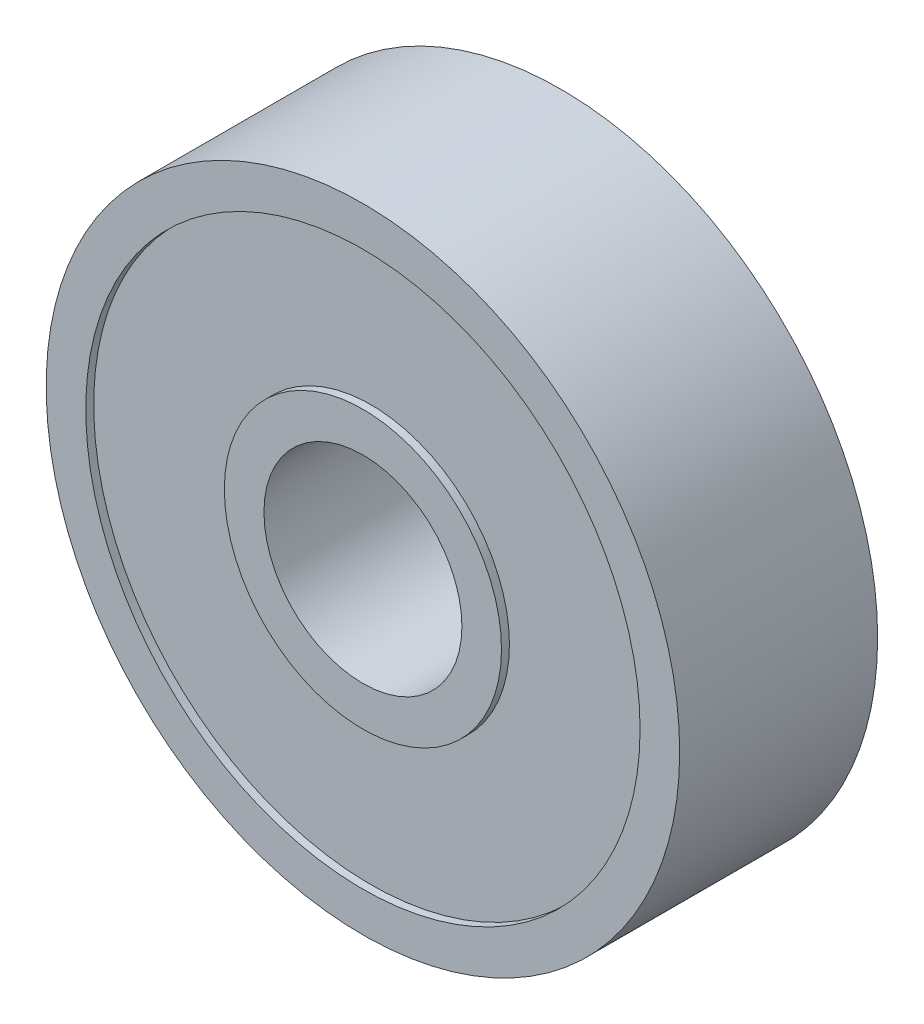
ISO-10303-21;
HEADER;
FILE_DESCRIPTION(('STEP AP214'),'2;1');
FILE_NAME('part.step','',(''),(''),'','','');
FILE_SCHEMA(('AUTOMOTIVE_DESIGN { 1 0 10303 214 1 1 1 1 }'));
ENDSEC;
DATA;
#1=APPLICATION_CONTEXT('core data for automotive mechanical design processes');
#2=APPLICATION_PROTOCOL_DEFINITION('international standard','automotive_design',2000,#1);
#3=PRODUCT_CONTEXT('',#1,'mechanical');
#4=PRODUCT('Part','Part','',(#3));
#5=PRODUCT_RELATED_PRODUCT_CATEGORY('part','',(#4));
#6=PRODUCT_DEFINITION_FORMATION('','',#4);
#7=PRODUCT_DEFINITION_CONTEXT('part definition',#1,'design');
#8=PRODUCT_DEFINITION('design','',#6,#7);
#9=PRODUCT_DEFINITION_SHAPE('','',#8);
#10=(LENGTH_UNIT() NAMED_UNIT(*) SI_UNIT(.MILLI.,.METRE.));
#11=(NAMED_UNIT(*) PLANE_ANGLE_UNIT() SI_UNIT($,.RADIAN.));
#12=(NAMED_UNIT(*) SI_UNIT($,.STERADIAN.) SOLID_ANGLE_UNIT());
#13=UNCERTAINTY_MEASURE_WITH_UNIT(LENGTH_MEASURE(1.E-05),#10,'distance_accuracy_value','');
#14=(GEOMETRIC_REPRESENTATION_CONTEXT(3) GLOBAL_UNCERTAINTY_ASSIGNED_CONTEXT((#13)) GLOBAL_UNIT_ASSIGNED_CONTEXT((#10,
#11,#12)) REPRESENTATION_CONTEXT('',''));
#15=CARTESIAN_POINT('',(0.,0.,0.));
#16=DIRECTION('',(0.,0.,1.));
#17=DIRECTION('',(1.,0.,0.));
#18=AXIS2_PLACEMENT_3D('',#15,#16,#17);
#19=CARTESIAN_POINT('',(0.,0.,2.5));
#20=DIRECTION('',(0.,0.,-1.));
#21=DIRECTION('',(0.,-1.,0.));
#22=AXIS2_PLACEMENT_3D('',#19,#20,#21);
#23=PLANE('',#22);
#24=CARTESIAN_POINT('',(0.,0.,2.5));
#25=DIRECTION('',(0.,0.,-1.));
#26=DIRECTION('',(1.,0.,0.));
#27=AXIS2_PLACEMENT_3D('',#24,#25,#26);
#28=CIRCLE('',#27,2.5);
#29=CARTESIAN_POINT('',(2.5,0.,2.5));
#30=VERTEX_POINT('',#29);
#31=EDGE_CURVE('E143',#30,#30,#28,.T.);
#32=ORIENTED_EDGE('',*,*,#31,.T.);
#33=EDGE_LOOP('',(#32));
#34=FACE_BOUND('',#33,.T.);
#35=CARTESIAN_POINT('',(0.,0.,2.5));
#36=DIRECTION('',(0.,0.,-1.));
#37=DIRECTION('',(1.,0.,0.));
#38=AXIS2_PLACEMENT_3D('',#35,#36,#37);
#39=CIRCLE('',#38,3.5);
#40=CARTESIAN_POINT('',(3.5,0.,2.5));
#41=VERTEX_POINT('',#40);
#42=EDGE_CURVE('E11',#41,#41,#39,.T.);
#43=ORIENTED_EDGE('',*,*,#42,.F.);
#44=EDGE_LOOP('',(#43));
#45=FACE_BOUND('',#44,.T.);
#46=ADVANCED_FACE('F17',(#34,#45),#23,.F.);
#47=CARTESIAN_POINT('',(0.,0.,2.3));
#48=DIRECTION('',(0.,0.,1.));
#49=DIRECTION('',(1.,0.,0.));
#50=AXIS2_PLACEMENT_3D('',#47,#48,#49);
#51=CYLINDRICAL_SURFACE('',#50,3.5);
#52=DIRECTION('',(0.,0.,1.));
#53=VECTOR('',#52,1.);
#54=CARTESIAN_POINT('',(3.5,0.,2.3));
#55=LINE('',#54,#53);
#56=CARTESIAN_POINT('',(3.5,0.,2.3));
#57=VERTEX_POINT('',#56);
#58=EDGE_CURVE('E27',#57,#41,#55,.T.);
#59=ORIENTED_EDGE('',*,*,#58,.T.);
#60=ORIENTED_EDGE('',*,*,#42,.T.);
#61=ORIENTED_EDGE('',*,*,#58,.F.);
#62=CARTESIAN_POINT('',(0.,0.,2.3));
#63=DIRECTION('',(0.,0.,-1.));
#64=DIRECTION('',(1.,0.,0.));
#65=AXIS2_PLACEMENT_3D('',#62,#63,#64);
#66=CIRCLE('',#65,3.5);
#67=EDGE_CURVE('E68',#57,#57,#66,.T.);
#68=ORIENTED_EDGE('',*,*,#67,.F.);
#69=EDGE_LOOP('',(#59,#60,#61,#68));
#70=FACE_BOUND('',#69,.T.);
#71=ADVANCED_FACE('F19',(#70),#51,.T.);
#72=CARTESIAN_POINT('',(0.,0.,2.3));
#73=DIRECTION('',(0.,0.,-1.));
#74=DIRECTION('',(0.,-1.,0.));
#75=AXIS2_PLACEMENT_3D('',#72,#73,#74);
#76=PLANE('',#75);
#77=ORIENTED_EDGE('',*,*,#67,.T.);
#78=EDGE_LOOP('',(#77));
#79=FACE_BOUND('',#78,.T.);
#80=CARTESIAN_POINT('',(0.,0.,2.3));
#81=DIRECTION('',(0.,0.,-1.));
#82=DIRECTION('',(1.,0.,0.));
#83=AXIS2_PLACEMENT_3D('',#80,#81,#82);
#84=CIRCLE('',#83,7.000000000001);
#85=CARTESIAN_POINT('',(7.000000000001,0.,2.3));
#86=VERTEX_POINT('',#85);
#87=EDGE_CURVE('E61',#86,#86,#84,.T.);
#88=ORIENTED_EDGE('',*,*,#87,.F.);
#89=EDGE_LOOP('',(#88));
#90=FACE_BOUND('',#89,.T.);
#91=ADVANCED_FACE('F95',(#79,#90),#76,.F.);
#92=CARTESIAN_POINT('',(0.,0.,2.5));
#93=DIRECTION('',(0.,0.,-1.));
#94=DIRECTION('',(1.,0.,0.));
#95=AXIS2_PLACEMENT_3D('',#92,#93,#94);
#96=CYLINDRICAL_SURFACE('',#95,7.000000000001);
#97=DIRECTION('',(0.,0.,-1.));
#98=VECTOR('',#97,1.);
#99=CARTESIAN_POINT('',(7.000000000001,0.,2.5));
#100=LINE('',#99,#98);
#101=CARTESIAN_POINT('',(7.000000000001,0.,2.5));
#102=VERTEX_POINT('',#101);
#103=EDGE_CURVE('E64',#102,#86,#100,.T.);
#104=ORIENTED_EDGE('',*,*,#103,.T.);
#105=ORIENTED_EDGE('',*,*,#87,.T.);
#106=ORIENTED_EDGE('',*,*,#103,.F.);
#107=CARTESIAN_POINT('',(0.,0.,2.5));
#108=DIRECTION('',(0.,0.,-1.));
#109=DIRECTION('',(1.,0.,0.));
#110=AXIS2_PLACEMENT_3D('',#107,#108,#109);
#111=CIRCLE('',#110,7.000000000001);
#112=EDGE_CURVE('E77',#102,#102,#111,.T.);
#113=ORIENTED_EDGE('',*,*,#112,.F.);
#114=EDGE_LOOP('',(#104,#105,#106,#113));
#115=FACE_BOUND('',#114,.T.);
#116=ADVANCED_FACE('F62',(#115),#96,.F.);
#117=CARTESIAN_POINT('',(0.,0.,2.5));
#118=DIRECTION('',(0.,0.,-1.));
#119=DIRECTION('',(0.,-1.,0.));
#120=AXIS2_PLACEMENT_3D('',#117,#118,#119);
#121=PLANE('',#120);
#122=ORIENTED_EDGE('',*,*,#112,.T.);
#123=EDGE_LOOP('',(#122));
#124=FACE_BOUND('',#123,.T.);
#125=CARTESIAN_POINT('',(0.,0.,2.5));
#126=DIRECTION('',(0.,0.,-1.));
#127=DIRECTION('',(1.,0.,0.));
#128=AXIS2_PLACEMENT_3D('',#125,#126,#127);
#129=CIRCLE('',#128,8.);
#130=CARTESIAN_POINT('',(8.,0.,2.5));
#131=VERTEX_POINT('',#130);
#132=EDGE_CURVE('E83',#131,#131,#129,.T.);
#133=ORIENTED_EDGE('',*,*,#132,.F.);
#134=EDGE_LOOP('',(#133));
#135=FACE_BOUND('',#134,.T.);
#136=ADVANCED_FACE('F104',(#124,#135),#121,.F.);
#137=CARTESIAN_POINT('',(0.,0.,-2.5));
#138=DIRECTION('',(0.,0.,1.));
#139=DIRECTION('',(1.,0.,0.));
#140=AXIS2_PLACEMENT_3D('',#137,#138,#139);
#141=CYLINDRICAL_SURFACE('',#140,8.);
#142=DIRECTION('',(0.,0.,1.));
#143=VECTOR('',#142,1.);
#144=CARTESIAN_POINT('',(8.,0.,-2.5));
#145=LINE('',#144,#143);
#146=CARTESIAN_POINT('',(8.,0.,-2.5));
#147=VERTEX_POINT('',#146);
#148=EDGE_CURVE('E86',#147,#131,#145,.T.);
#149=ORIENTED_EDGE('',*,*,#148,.T.);
#150=ORIENTED_EDGE('',*,*,#132,.T.);
#151=ORIENTED_EDGE('',*,*,#148,.F.);
#152=CARTESIAN_POINT('',(0.,0.,-2.5));
#153=DIRECTION('',(0.,0.,-1.));
#154=DIRECTION('',(1.,0.,0.));
#155=AXIS2_PLACEMENT_3D('',#152,#153,#154);
#156=CIRCLE('',#155,8.);
#157=EDGE_CURVE('E89',#147,#147,#156,.T.);
#158=ORIENTED_EDGE('',*,*,#157,.F.);
#159=EDGE_LOOP('',(#149,#150,#151,#158));
#160=FACE_BOUND('',#159,.T.);
#161=ADVANCED_FACE('F117',(#160),#141,.T.);
#162=CARTESIAN_POINT('',(0.,0.,-2.5));
#163=DIRECTION('',(0.,0.,1.));
#164=DIRECTION('',(1.,0.,0.));
#165=AXIS2_PLACEMENT_3D('',#162,#163,#164);
#166=PLANE('',#165);
#167=ORIENTED_EDGE('',*,*,#157,.T.);
#168=EDGE_LOOP('',(#167));
#169=FACE_BOUND('',#168,.T.);
#170=CARTESIAN_POINT('',(0.,0.,-2.5));
#171=DIRECTION('',(0.,0.,-1.));
#172=DIRECTION('',(1.,0.,0.));
#173=AXIS2_PLACEMENT_3D('',#170,#171,#172);
#174=CIRCLE('',#173,7.000000000001);
#175=CARTESIAN_POINT('',(7.000000000001,0.,-2.5));
#176=VERTEX_POINT('',#175);
#177=EDGE_CURVE('E81',#176,#176,#174,.T.);
#178=ORIENTED_EDGE('',*,*,#177,.F.);
#179=EDGE_LOOP('',(#178));
#180=FACE_BOUND('',#179,.T.);
#181=ADVANCED_FACE('F116',(#169,#180),#166,.F.);
#182=CARTESIAN_POINT('',(0.,0.,-2.3));
#183=DIRECTION('',(0.,0.,-1.));
#184=DIRECTION('',(1.,0.,0.));
#185=AXIS2_PLACEMENT_3D('',#182,#183,#184);
#186=CYLINDRICAL_SURFACE('',#185,7.000000000001);
#187=DIRECTION('',(0.,0.,-1.));
#188=VECTOR('',#187,1.);
#189=CARTESIAN_POINT('',(7.000000000001,0.,-2.3));
#190=LINE('',#189,#188);
#191=CARTESIAN_POINT('',(7.000000000001,0.,-2.3));
#192=VERTEX_POINT('',#191);
#193=EDGE_CURVE('E141',#192,#176,#190,.T.);
#194=ORIENTED_EDGE('',*,*,#193,.T.);
#195=ORIENTED_EDGE('',*,*,#177,.T.);
#196=ORIENTED_EDGE('',*,*,#193,.F.);
#197=CARTESIAN_POINT('',(0.,0.,-2.3));
#198=DIRECTION('',(0.,0.,-1.));
#199=DIRECTION('',(1.,0.,0.));
#200=AXIS2_PLACEMENT_3D('',#197,#198,#199);
#201=CIRCLE('',#200,7.000000000001);
#202=EDGE_CURVE('E166',#192,#192,#201,.T.);
#203=ORIENTED_EDGE('',*,*,#202,.F.);
#204=EDGE_LOOP('',(#194,#195,#196,#203));
#205=FACE_BOUND('',#204,.T.);
#206=ADVANCED_FACE('F125',(#205),#186,.F.);
#207=CARTESIAN_POINT('',(0.,0.,-2.3));
#208=DIRECTION('',(0.,0.,1.));
#209=DIRECTION('',(1.,0.,0.));
#210=AXIS2_PLACEMENT_3D('',#207,#208,#209);
#211=PLANE('',#210);
#212=ORIENTED_EDGE('',*,*,#202,.T.);
#213=EDGE_LOOP('',(#212));
#214=FACE_BOUND('',#213,.T.);
#215=CARTESIAN_POINT('',(0.,0.,-2.3));
#216=DIRECTION('',(0.,0.,-1.));
#217=DIRECTION('',(1.,0.,0.));
#218=AXIS2_PLACEMENT_3D('',#215,#216,#217);
#219=CIRCLE('',#218,3.5);
#220=CARTESIAN_POINT('',(3.5,0.,-2.3));
#221=VERTEX_POINT('',#220);
#222=EDGE_CURVE('E161',#221,#221,#219,.T.);
#223=ORIENTED_EDGE('',*,*,#222,.F.);
#224=EDGE_LOOP('',(#223));
#225=FACE_BOUND('',#224,.T.);
#226=ADVANCED_FACE('F181',(#214,#225),#211,.F.);
#227=CARTESIAN_POINT('',(0.,0.,-2.5));
#228=DIRECTION('',(0.,0.,1.));
#229=DIRECTION('',(1.,0.,0.));
#230=AXIS2_PLACEMENT_3D('',#227,#228,#229);
#231=CYLINDRICAL_SURFACE('',#230,3.5);
#232=DIRECTION('',(0.,0.,1.));
#233=VECTOR('',#232,1.);
#234=CARTESIAN_POINT('',(3.5,0.,-2.5));
#235=LINE('',#234,#233);
#236=CARTESIAN_POINT('',(3.5,0.,-2.5));
#237=VERTEX_POINT('',#236);
#238=EDGE_CURVE('E158',#237,#221,#235,.T.);
#239=ORIENTED_EDGE('',*,*,#238,.T.);
#240=ORIENTED_EDGE('',*,*,#222,.T.);
#241=ORIENTED_EDGE('',*,*,#238,.F.);
#242=CARTESIAN_POINT('',(0.,0.,-2.5));
#243=DIRECTION('',(0.,0.,-1.));
#244=DIRECTION('',(1.,0.,0.));
#245=AXIS2_PLACEMENT_3D('',#242,#243,#244);
#246=CIRCLE('',#245,3.5);
#247=EDGE_CURVE('E146',#237,#237,#246,.T.);
#248=ORIENTED_EDGE('',*,*,#247,.F.);
#249=EDGE_LOOP('',(#239,#240,#241,#248));
#250=FACE_BOUND('',#249,.T.);
#251=ADVANCED_FACE('F184',(#250),#231,.T.);
#252=CARTESIAN_POINT('',(0.,0.,-2.5));
#253=DIRECTION('',(0.,0.,1.));
#254=DIRECTION('',(1.,0.,0.));
#255=AXIS2_PLACEMENT_3D('',#252,#253,#254);
#256=PLANE('',#255);
#257=ORIENTED_EDGE('',*,*,#247,.T.);
#258=EDGE_LOOP('',(#257));
#259=FACE_BOUND('',#258,.T.);
#260=CARTESIAN_POINT('',(0.,0.,-2.5));
#261=DIRECTION('',(0.,0.,-1.));
#262=DIRECTION('',(1.,0.,0.));
#263=AXIS2_PLACEMENT_3D('',#260,#261,#262);
#264=CIRCLE('',#263,2.5);
#265=CARTESIAN_POINT('',(2.5,0.,-2.5));
#266=VERTEX_POINT('',#265);
#267=EDGE_CURVE('E147',#266,#266,#264,.T.);
#268=ORIENTED_EDGE('',*,*,#267,.F.);
#269=EDGE_LOOP('',(#268));
#270=FACE_BOUND('',#269,.T.);
#271=ADVANCED_FACE('F196',(#259,#270),#256,.F.);
#272=CARTESIAN_POINT('',(0.,0.,2.5));
#273=DIRECTION('',(0.,0.,-1.));
#274=DIRECTION('',(1.,0.,0.));
#275=AXIS2_PLACEMENT_3D('',#272,#273,#274);
#276=CYLINDRICAL_SURFACE('',#275,2.5);
#277=DIRECTION('',(0.,0.,-1.));
#278=VECTOR('',#277,1.);
#279=CARTESIAN_POINT('',(2.5,0.,2.5));
#280=LINE('',#279,#278);
#281=EDGE_CURVE('E148',#30,#266,#280,.T.);
#282=ORIENTED_EDGE('',*,*,#281,.T.);
#283=ORIENTED_EDGE('',*,*,#267,.T.);
#284=ORIENTED_EDGE('',*,*,#281,.F.);
#285=ORIENTED_EDGE('',*,*,#31,.F.);
#286=EDGE_LOOP('',(#282,#283,#284,#285));
#287=FACE_BOUND('',#286,.T.);
#288=ADVANCED_FACE('F199',(#287),#276,.F.);
#289=CLOSED_SHELL('',(#46,#71,#91,#116,#136,#161,#181,#206,#226,#251,#271,#288));
#290=MANIFOLD_SOLID_BREP('B1',#289);
#291=ADVANCED_BREP_SHAPE_REPRESENTATION('',(#18,#290),#14);
#292=SHAPE_DEFINITION_REPRESENTATION(#9,#291);
ENDSEC;
END-ISO-10303-21;
